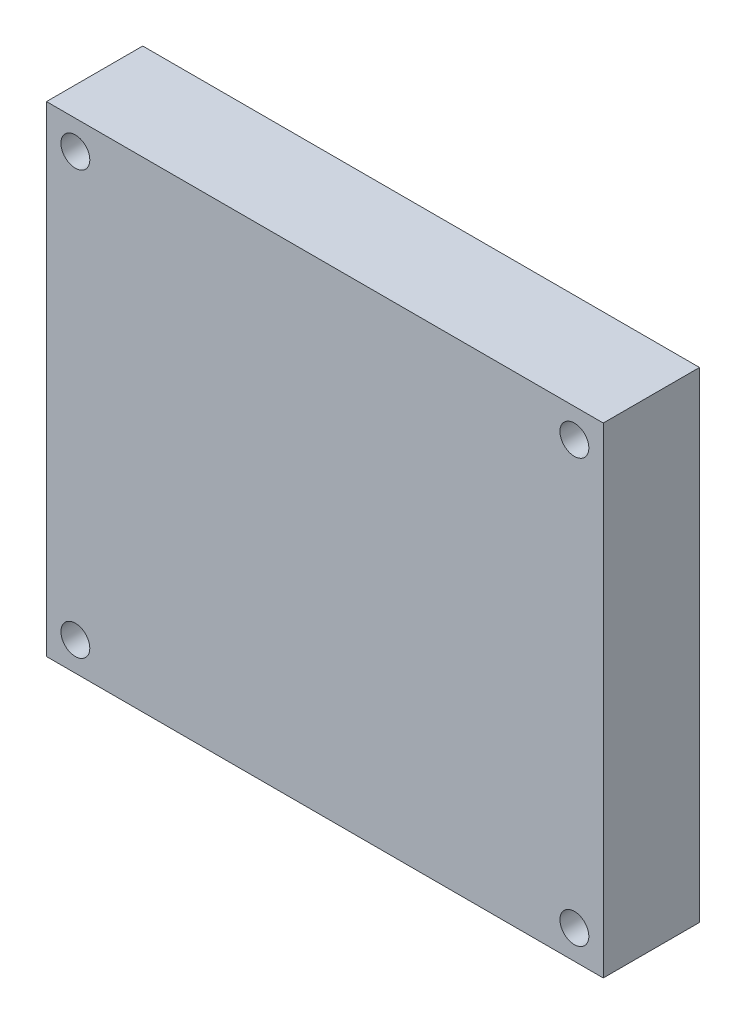
ISO-10303-21;
HEADER;
FILE_DESCRIPTION(('STEP AP214'),'2;1');
FILE_NAME('part.step','',(''),(''),'','','');
FILE_SCHEMA(('AUTOMOTIVE_DESIGN { 1 0 10303 214 1 1 1 1 }'));
ENDSEC;
DATA;
#1=APPLICATION_CONTEXT('core data for automotive mechanical design processes');
#2=APPLICATION_PROTOCOL_DEFINITION('international standard','automotive_design',2000,#1);
#3=PRODUCT_CONTEXT('',#1,'mechanical');
#4=PRODUCT('Part','Part','',(#3));
#5=PRODUCT_RELATED_PRODUCT_CATEGORY('part','',(#4));
#6=PRODUCT_DEFINITION_FORMATION('','',#4);
#7=PRODUCT_DEFINITION_CONTEXT('part definition',#1,'design');
#8=PRODUCT_DEFINITION('design','',#6,#7);
#9=PRODUCT_DEFINITION_SHAPE('','',#8);
#10=(LENGTH_UNIT() NAMED_UNIT(*) SI_UNIT(.MILLI.,.METRE.));
#11=(NAMED_UNIT(*) PLANE_ANGLE_UNIT() SI_UNIT($,.RADIAN.));
#12=(NAMED_UNIT(*) SI_UNIT($,.STERADIAN.) SOLID_ANGLE_UNIT());
#13=UNCERTAINTY_MEASURE_WITH_UNIT(LENGTH_MEASURE(1.E-05),#10,'distance_accuracy_value','');
#14=(GEOMETRIC_REPRESENTATION_CONTEXT(3) GLOBAL_UNCERTAINTY_ASSIGNED_CONTEXT((#13)) GLOBAL_UNIT_ASSIGNED_CONTEXT((#10,
#11,#12)) REPRESENTATION_CONTEXT('',''));
#15=CARTESIAN_POINT('',(0.,0.,0.));
#16=DIRECTION('',(0.,0.,1.));
#17=DIRECTION('',(1.,0.,0.));
#18=AXIS2_PLACEMENT_3D('',#15,#16,#17);
#19=CARTESIAN_POINT('',(0.,0.,10.));
#20=DIRECTION('',(0.,0.,1.));
#21=DIRECTION('',(1.,0.,0.));
#22=AXIS2_PLACEMENT_3D('',#19,#20,#21);
#23=PLANE('',#22);
#24=CARTESIAN_POINT('',(51.849,-43.936,10.));
#25=DIRECTION('',(0.,0.,1.));
#26=DIRECTION('',(1.,0.,0.));
#27=AXIS2_PLACEMENT_3D('',#24,#25,#26);
#28=CIRCLE('',#27,1.5);
#29=CARTESIAN_POINT('',(53.349,-43.936,10.));
#30=VERTEX_POINT('',#29);
#31=EDGE_CURVE('E142',#30,#30,#28,.T.);
#32=ORIENTED_EDGE('',*,*,#31,.F.);
#33=EDGE_LOOP('',(#32));
#34=FACE_BOUND('',#33,.T.);
#35=CARTESIAN_POINT('',(0.,0.,10.));
#36=DIRECTION('',(0.,0.,1.));
#37=DIRECTION('',(1.,0.,0.));
#38=AXIS2_PLACEMENT_3D('',#35,#36,#37);
#39=CIRCLE('',#38,1.5);
#40=CARTESIAN_POINT('',(1.5,0.,10.));
#41=VERTEX_POINT('',#40);
#42=EDGE_CURVE('E112',#41,#41,#39,.T.);
#43=ORIENTED_EDGE('',*,*,#42,.F.);
#44=EDGE_LOOP('',(#43));
#45=FACE_BOUND('',#44,.T.);
#46=DIRECTION('',(0.,-1.,0.));
#47=VECTOR('',#46,1.);
#48=CARTESIAN_POINT('',(-3.,3.,10.));
#49=LINE('',#48,#47);
#50=CARTESIAN_POINT('',(-3.,3.,10.));
#51=VERTEX_POINT('',#50);
#52=CARTESIAN_POINT('',(-3.,-46.936,10.));
#53=VERTEX_POINT('',#52);
#54=EDGE_CURVE('E92',#51,#53,#49,.T.);
#55=ORIENTED_EDGE('',*,*,#54,.T.);
#56=DIRECTION('',(1.,0.,0.));
#57=VECTOR('',#56,1.);
#58=CARTESIAN_POINT('',(-3.,-46.936,10.));
#59=LINE('',#58,#57);
#60=CARTESIAN_POINT('',(54.849,-46.936,10.));
#61=VERTEX_POINT('',#60);
#62=EDGE_CURVE('E87',#53,#61,#59,.T.);
#63=ORIENTED_EDGE('',*,*,#62,.T.);
#64=DIRECTION('',(0.,1.,0.));
#65=VECTOR('',#64,1.);
#66=CARTESIAN_POINT('',(54.849,3.,10.));
#67=LINE('',#66,#65);
#68=CARTESIAN_POINT('',(54.849,3.,10.));
#69=VERTEX_POINT('',#68);
#70=EDGE_CURVE('E90',#61,#69,#67,.T.);
#71=ORIENTED_EDGE('',*,*,#70,.T.);
#72=DIRECTION('',(-1.,0.,0.));
#73=VECTOR('',#72,1.);
#74=CARTESIAN_POINT('',(-3.,3.,10.));
#75=LINE('',#74,#73);
#76=EDGE_CURVE('E57',#69,#51,#75,.T.);
#77=ORIENTED_EDGE('',*,*,#76,.T.);
#78=EDGE_LOOP('',(#55,#63,#71,#77));
#79=FACE_BOUND('',#78,.T.);
#80=CARTESIAN_POINT('',(51.849,0.,10.));
#81=DIRECTION('',(0.,0.,1.));
#82=DIRECTION('',(1.,0.,0.));
#83=AXIS2_PLACEMENT_3D('',#80,#81,#82);
#84=CIRCLE('',#83,1.5);
#85=CARTESIAN_POINT('',(53.349,0.,10.));
#86=VERTEX_POINT('',#85);
#87=EDGE_CURVE('E134',#86,#86,#84,.T.);
#88=ORIENTED_EDGE('',*,*,#87,.F.);
#89=EDGE_LOOP('',(#88));
#90=FACE_BOUND('',#89,.T.);
#91=CARTESIAN_POINT('',(0.,-43.936,10.));
#92=DIRECTION('',(0.,0.,1.));
#93=DIRECTION('',(1.,0.,0.));
#94=AXIS2_PLACEMENT_3D('',#91,#92,#93);
#95=CIRCLE('',#94,1.5);
#96=CARTESIAN_POINT('',(1.50000000000001,-43.936,10.));
#97=VERTEX_POINT('',#96);
#98=EDGE_CURVE('E150',#97,#97,#95,.T.);
#99=ORIENTED_EDGE('',*,*,#98,.F.);
#100=EDGE_LOOP('',(#99));
#101=FACE_BOUND('',#100,.T.);
#102=ADVANCED_FACE('F39',(#34,#45,#79,#90,#101),#23,.T.);
#103=CARTESIAN_POINT('',(0.,0.,0.));
#104=DIRECTION('',(0.,0.,1.));
#105=DIRECTION('',(1.,0.,0.));
#106=AXIS2_PLACEMENT_3D('',#103,#104,#105);
#107=PLANE('',#106);
#108=DIRECTION('',(0.,-1.,0.));
#109=VECTOR('',#108,1.);
#110=CARTESIAN_POINT('',(-3.,3.,0.));
#111=LINE('',#110,#109);
#112=CARTESIAN_POINT('',(-3.,3.,0.));
#113=VERTEX_POINT('',#112);
#114=CARTESIAN_POINT('',(-3.,-46.936,0.));
#115=VERTEX_POINT('',#114);
#116=EDGE_CURVE('E108',#113,#115,#111,.T.);
#117=ORIENTED_EDGE('',*,*,#116,.F.);
#118=DIRECTION('',(-1.,0.,0.));
#119=VECTOR('',#118,1.);
#120=CARTESIAN_POINT('',(-3.,3.,0.));
#121=LINE('',#120,#119);
#122=CARTESIAN_POINT('',(54.849,3.,0.));
#123=VERTEX_POINT('',#122);
#124=EDGE_CURVE('E80',#123,#113,#121,.T.);
#125=ORIENTED_EDGE('',*,*,#124,.F.);
#126=DIRECTION('',(0.,1.,0.));
#127=VECTOR('',#126,1.);
#128=CARTESIAN_POINT('',(54.849,3.,0.));
#129=LINE('',#128,#127);
#130=CARTESIAN_POINT('',(54.849,-46.936,0.));
#131=VERTEX_POINT('',#130);
#132=EDGE_CURVE('E74',#131,#123,#129,.T.);
#133=ORIENTED_EDGE('',*,*,#132,.F.);
#134=DIRECTION('',(1.,0.,0.));
#135=VECTOR('',#134,1.);
#136=CARTESIAN_POINT('',(-3.,-46.936,0.));
#137=LINE('',#136,#135);
#138=EDGE_CURVE('E97',#115,#131,#137,.T.);
#139=ORIENTED_EDGE('',*,*,#138,.F.);
#140=EDGE_LOOP('',(#117,#125,#133,#139));
#141=FACE_BOUND('',#140,.T.);
#142=CARTESIAN_POINT('',(0.,0.,0.));
#143=DIRECTION('',(0.,0.,1.));
#144=DIRECTION('',(1.,0.,0.));
#145=AXIS2_PLACEMENT_3D('',#142,#143,#144);
#146=CIRCLE('',#145,1.5);
#147=CARTESIAN_POINT('',(1.5,0.,0.));
#148=VERTEX_POINT('',#147);
#149=EDGE_CURVE('E130',#148,#148,#146,.T.);
#150=ORIENTED_EDGE('',*,*,#149,.T.);
#151=EDGE_LOOP('',(#150));
#152=FACE_BOUND('',#151,.T.);
#153=CARTESIAN_POINT('',(51.849,0.,0.));
#154=DIRECTION('',(0.,0.,1.));
#155=DIRECTION('',(1.,0.,0.));
#156=AXIS2_PLACEMENT_3D('',#153,#154,#155);
#157=CIRCLE('',#156,1.5);
#158=CARTESIAN_POINT('',(53.349,0.,0.));
#159=VERTEX_POINT('',#158);
#160=EDGE_CURVE('E138',#159,#159,#157,.T.);
#161=ORIENTED_EDGE('',*,*,#160,.T.);
#162=EDGE_LOOP('',(#161));
#163=FACE_BOUND('',#162,.T.);
#164=CARTESIAN_POINT('',(51.849,-43.936,0.));
#165=DIRECTION('',(0.,0.,1.));
#166=DIRECTION('',(1.,0.,0.));
#167=AXIS2_PLACEMENT_3D('',#164,#165,#166);
#168=CIRCLE('',#167,1.5);
#169=CARTESIAN_POINT('',(53.349,-43.936,0.));
#170=VERTEX_POINT('',#169);
#171=EDGE_CURVE('E146',#170,#170,#168,.T.);
#172=ORIENTED_EDGE('',*,*,#171,.T.);
#173=EDGE_LOOP('',(#172));
#174=FACE_BOUND('',#173,.T.);
#175=CARTESIAN_POINT('',(0.,-43.936,0.));
#176=DIRECTION('',(0.,0.,1.));
#177=DIRECTION('',(1.,0.,0.));
#178=AXIS2_PLACEMENT_3D('',#175,#176,#177);
#179=CIRCLE('',#178,1.5);
#180=CARTESIAN_POINT('',(1.50000000000001,-43.936,0.));
#181=VERTEX_POINT('',#180);
#182=EDGE_CURVE('E154',#181,#181,#179,.T.);
#183=ORIENTED_EDGE('',*,*,#182,.T.);
#184=EDGE_LOOP('',(#183));
#185=FACE_BOUND('',#184,.T.);
#186=ADVANCED_FACE('F125',(#141,#152,#163,#174,#185),#107,.F.);
#187=CARTESIAN_POINT('',(-3.,3.,10.));
#188=DIRECTION('',(1.,0.,0.));
#189=DIRECTION('',(0.,0.,-1.));
#190=AXIS2_PLACEMENT_3D('',#187,#188,#189);
#191=PLANE('',#190);
#192=ORIENTED_EDGE('',*,*,#116,.T.);
#193=DIRECTION('',(0.,0.,-1.));
#194=VECTOR('',#193,1.);
#195=CARTESIAN_POINT('',(-3.,-46.936,10.));
#196=LINE('',#195,#194);
#197=EDGE_CURVE('E11',#53,#115,#196,.T.);
#198=ORIENTED_EDGE('',*,*,#197,.F.);
#199=ORIENTED_EDGE('',*,*,#54,.F.);
#200=DIRECTION('',(0.,0.,-1.));
#201=VECTOR('',#200,1.);
#202=CARTESIAN_POINT('',(-3.,3.,10.));
#203=LINE('',#202,#201);
#204=EDGE_CURVE('E104',#51,#113,#203,.T.);
#205=ORIENTED_EDGE('',*,*,#204,.T.);
#206=EDGE_LOOP('',(#192,#198,#199,#205));
#207=FACE_BOUND('',#206,.T.);
#208=ADVANCED_FACE('F41',(#207),#191,.F.);
#209=CARTESIAN_POINT('',(-3.,-46.936,10.));
#210=DIRECTION('',(0.,1.,0.));
#211=DIRECTION('',(0.,0.,1.));
#212=AXIS2_PLACEMENT_3D('',#209,#210,#211);
#213=PLANE('',#212);
#214=ORIENTED_EDGE('',*,*,#138,.T.);
#215=DIRECTION('',(0.,0.,-1.));
#216=VECTOR('',#215,1.);
#217=CARTESIAN_POINT('',(54.849,-46.936,10.));
#218=LINE('',#217,#216);
#219=EDGE_CURVE('E49',#61,#131,#218,.T.);
#220=ORIENTED_EDGE('',*,*,#219,.F.);
#221=ORIENTED_EDGE('',*,*,#62,.F.);
#222=ORIENTED_EDGE('',*,*,#197,.T.);
#223=EDGE_LOOP('',(#214,#220,#221,#222));
#224=FACE_BOUND('',#223,.T.);
#225=ADVANCED_FACE('F96',(#224),#213,.F.);
#226=CARTESIAN_POINT('',(54.849,3.,10.));
#227=DIRECTION('',(-1.,0.,0.));
#228=DIRECTION('',(0.,0.,1.));
#229=AXIS2_PLACEMENT_3D('',#226,#227,#228);
#230=PLANE('',#229);
#231=ORIENTED_EDGE('',*,*,#132,.T.);
#232=DIRECTION('',(0.,0.,-1.));
#233=VECTOR('',#232,1.);
#234=CARTESIAN_POINT('',(54.849,3.,10.));
#235=LINE('',#234,#233);
#236=EDGE_CURVE('E99',#69,#123,#235,.T.);
#237=ORIENTED_EDGE('',*,*,#236,.F.);
#238=ORIENTED_EDGE('',*,*,#70,.F.);
#239=ORIENTED_EDGE('',*,*,#219,.T.);
#240=EDGE_LOOP('',(#231,#237,#238,#239));
#241=FACE_BOUND('',#240,.T.);
#242=ADVANCED_FACE('F100',(#241),#230,.F.);
#243=CARTESIAN_POINT('',(-3.,3.,10.));
#244=DIRECTION('',(0.,-1.,0.));
#245=DIRECTION('',(0.,0.,-1.));
#246=AXIS2_PLACEMENT_3D('',#243,#244,#245);
#247=PLANE('',#246);
#248=ORIENTED_EDGE('',*,*,#124,.T.);
#249=ORIENTED_EDGE('',*,*,#204,.F.);
#250=ORIENTED_EDGE('',*,*,#76,.F.);
#251=ORIENTED_EDGE('',*,*,#236,.T.);
#252=EDGE_LOOP('',(#248,#249,#250,#251));
#253=FACE_BOUND('',#252,.T.);
#254=ADVANCED_FACE('F122',(#253),#247,.F.);
#255=CARTESIAN_POINT('',(0.,0.,10.));
#256=DIRECTION('',(0.,0.,-1.));
#257=DIRECTION('',(-1.,0.,0.));
#258=AXIS2_PLACEMENT_3D('',#255,#256,#257);
#259=CYLINDRICAL_SURFACE('',#258,1.5);
#260=ORIENTED_EDGE('',*,*,#42,.T.);
#261=EDGE_LOOP('',(#260));
#262=FACE_BOUND('',#261,.T.);
#263=ORIENTED_EDGE('',*,*,#149,.F.);
#264=EDGE_LOOP('',(#263));
#265=FACE_BOUND('',#264,.T.);
#266=ADVANCED_FACE('F175',(#262,#265),#259,.F.);
#267=CARTESIAN_POINT('',(51.849,0.,10.));
#268=DIRECTION('',(0.,0.,-1.));
#269=DIRECTION('',(-1.,0.,0.));
#270=AXIS2_PLACEMENT_3D('',#267,#268,#269);
#271=CYLINDRICAL_SURFACE('',#270,1.5);
#272=ORIENTED_EDGE('',*,*,#87,.T.);
#273=EDGE_LOOP('',(#272));
#274=FACE_BOUND('',#273,.T.);
#275=ORIENTED_EDGE('',*,*,#160,.F.);
#276=EDGE_LOOP('',(#275));
#277=FACE_BOUND('',#276,.T.);
#278=ADVANCED_FACE('F221',(#274,#277),#271,.F.);
#279=CARTESIAN_POINT('',(51.849,-43.936,10.));
#280=DIRECTION('',(0.,0.,-1.));
#281=DIRECTION('',(-1.,0.,0.));
#282=AXIS2_PLACEMENT_3D('',#279,#280,#281);
#283=CYLINDRICAL_SURFACE('',#282,1.5);
#284=ORIENTED_EDGE('',*,*,#31,.T.);
#285=EDGE_LOOP('',(#284));
#286=FACE_BOUND('',#285,.T.);
#287=ORIENTED_EDGE('',*,*,#171,.F.);
#288=EDGE_LOOP('',(#287));
#289=FACE_BOUND('',#288,.T.);
#290=ADVANCED_FACE('F229',(#286,#289),#283,.F.);
#291=CARTESIAN_POINT('',(0.,-43.936,10.));
#292=DIRECTION('',(0.,0.,-1.));
#293=DIRECTION('',(-1.,0.,0.));
#294=AXIS2_PLACEMENT_3D('',#291,#292,#293);
#295=CYLINDRICAL_SURFACE('',#294,1.5);
#296=ORIENTED_EDGE('',*,*,#98,.T.);
#297=EDGE_LOOP('',(#296));
#298=FACE_BOUND('',#297,.T.);
#299=ORIENTED_EDGE('',*,*,#182,.F.);
#300=EDGE_LOOP('',(#299));
#301=FACE_BOUND('',#300,.T.);
#302=ADVANCED_FACE('F162',(#298,#301),#295,.F.);
#303=CLOSED_SHELL('',(#102,#186,#208,#225,#242,#254,#266,#278,#290,#302));
#304=MANIFOLD_SOLID_BREP('B2',#303);
#305=ADVANCED_BREP_SHAPE_REPRESENTATION('',(#18,#304),#14);
#306=SHAPE_DEFINITION_REPRESENTATION(#9,#305);
ENDSEC;
END-ISO-10303-21;
